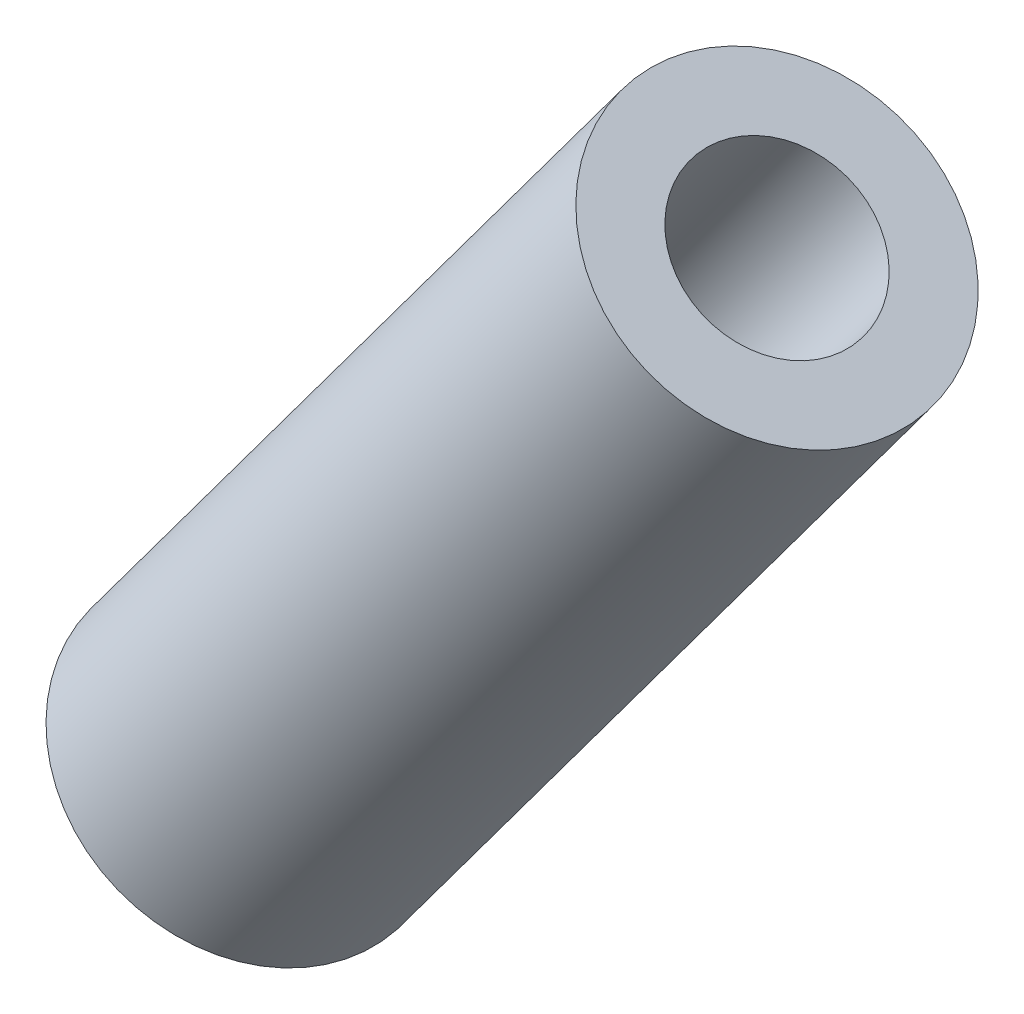
ISO-10303-21;
HEADER;
FILE_DESCRIPTION(('STEP AP214'),'2;1');
FILE_NAME('part.step','',(''),(''),'','','');
FILE_SCHEMA(('AUTOMOTIVE_DESIGN { 1 0 10303 214 1 1 1 1 }'));
ENDSEC;
DATA;
#1=APPLICATION_CONTEXT('core data for automotive mechanical design processes');
#2=APPLICATION_PROTOCOL_DEFINITION('international standard','automotive_design',2000,#1);
#3=PRODUCT_CONTEXT('',#1,'mechanical');
#4=PRODUCT('Part','Part','',(#3));
#5=PRODUCT_RELATED_PRODUCT_CATEGORY('part','',(#4));
#6=PRODUCT_DEFINITION_FORMATION('','',#4);
#7=PRODUCT_DEFINITION_CONTEXT('part definition',#1,'design');
#8=PRODUCT_DEFINITION('design','',#6,#7);
#9=PRODUCT_DEFINITION_SHAPE('','',#8);
#10=(LENGTH_UNIT() NAMED_UNIT(*) SI_UNIT(.MILLI.,.METRE.));
#11=(NAMED_UNIT(*) PLANE_ANGLE_UNIT() SI_UNIT($,.RADIAN.));
#12=(NAMED_UNIT(*) SI_UNIT($,.STERADIAN.) SOLID_ANGLE_UNIT());
#13=UNCERTAINTY_MEASURE_WITH_UNIT(LENGTH_MEASURE(1.E-05),#10,'distance_accuracy_value','');
#14=(GEOMETRIC_REPRESENTATION_CONTEXT(3) GLOBAL_UNCERTAINTY_ASSIGNED_CONTEXT((#13)) GLOBAL_UNIT_ASSIGNED_CONTEXT((#10,
#11,#12)) REPRESENTATION_CONTEXT('',''));
#15=CARTESIAN_POINT('',(0.,0.,0.));
#16=DIRECTION('',(0.,0.,1.));
#17=DIRECTION('',(1.,0.,0.));
#18=AXIS2_PLACEMENT_3D('',#15,#16,#17);
#19=CARTESIAN_POINT('',(0.,0.,0.));
#20=DIRECTION('',(0.596262476018023,0.802789548818902,0.));
#21=DIRECTION('',(-0.802789548818902,0.596262476018023,0.));
#22=AXIS2_PLACEMENT_3D('',#19,#20,#21);
#23=PLANE('',#22);
#24=CARTESIAN_POINT('',(0.,0.,0.));
#25=DIRECTION('',(0.596262476018023,0.802789548818902,0.));
#26=DIRECTION('',(-0.802789548818902,0.596262476018023,0.));
#27=AXIS2_PLACEMENT_3D('',#24,#25,#26);
#28=CIRCLE('',#27,5.);
#29=CARTESIAN_POINT('',(-4.01394774409451,2.98131238009012,0.));
#30=VERTEX_POINT('',#29);
#31=EDGE_CURVE('E65',#30,#30,#28,.F.);
#32=ORIENTED_EDGE('',*,*,#31,.F.);
#33=EDGE_LOOP('',(#32));
#34=FACE_BOUND('',#33,.T.);
#35=CARTESIAN_POINT('',(0.,0.,0.));
#36=DIRECTION('',(0.596262476018023,0.802789548818902,0.));
#37=DIRECTION('',(-0.802789548818902,0.596262476018023,0.));
#38=AXIS2_PLACEMENT_3D('',#35,#36,#37);
#39=CIRCLE('',#38,8.96875);
#40=CARTESIAN_POINT('',(-7.20001876596953,5.34772908178665,0.));
#41=VERTEX_POINT('',#40);
#42=EDGE_CURVE('E57',#41,#41,#39,.T.);
#43=ORIENTED_EDGE('',*,*,#42,.F.);
#44=EDGE_LOOP('',(#43));
#45=FACE_BOUND('',#44,.T.);
#46=ADVANCED_FACE('F51',(#34,#45),#23,.F.);
#47=CARTESIAN_POINT('',(30.2901337817156,40.7817090800002,0.));
#48=DIRECTION('',(0.596262476018023,0.802789548818902,0.));
#49=DIRECTION('',(-0.802789548818902,0.596262476018023,0.));
#50=AXIS2_PLACEMENT_3D('',#47,#48,#49);
#51=PLANE('',#50);
#52=CARTESIAN_POINT('',(30.2901337817156,40.7817090800002,0.));
#53=DIRECTION('',(0.596262476018023,0.802789548818902,0.));
#54=DIRECTION('',(-0.802789548818902,0.596262476018023,0.));
#55=AXIS2_PLACEMENT_3D('',#52,#53,#54);
#56=CIRCLE('',#55,5.);
#57=CARTESIAN_POINT('',(26.2761860376211,43.7630214600904,0.));
#58=VERTEX_POINT('',#57);
#59=EDGE_CURVE('E61',#58,#58,#56,.F.);
#60=ORIENTED_EDGE('',*,*,#59,.T.);
#61=EDGE_LOOP('',(#60));
#62=FACE_BOUND('',#61,.T.);
#63=CARTESIAN_POINT('',(30.2901337817156,40.7817090800002,0.));
#64=DIRECTION('',(0.596262476018023,0.802789548818902,0.));
#65=DIRECTION('',(-0.802789548818902,0.596262476018023,0.));
#66=AXIS2_PLACEMENT_3D('',#63,#64,#65);
#67=CIRCLE('',#66,8.96875);
#68=CARTESIAN_POINT('',(23.0901150157461,46.1294381617869,0.));
#69=VERTEX_POINT('',#68);
#70=EDGE_CURVE('E11',#69,#69,#67,.T.);
#71=ORIENTED_EDGE('',*,*,#70,.T.);
#72=EDGE_LOOP('',(#71));
#73=FACE_BOUND('',#72,.T.);
#74=ADVANCED_FACE('F76',(#62,#73),#51,.T.);
#75=CARTESIAN_POINT('',(0.,0.,0.));
#76=DIRECTION('',(0.596262476018023,0.802789548818902,0.));
#77=DIRECTION('',(-0.802789548818902,0.596262476018023,0.));
#78=AXIS2_PLACEMENT_3D('',#75,#76,#77);
#79=CYLINDRICAL_SURFACE('',#78,8.96875);
#80=ORIENTED_EDGE('',*,*,#70,.F.);
#81=EDGE_LOOP('',(#80));
#82=FACE_BOUND('',#81,.T.);
#83=ORIENTED_EDGE('',*,*,#42,.T.);
#84=EDGE_LOOP('',(#83));
#85=FACE_BOUND('',#84,.T.);
#86=ADVANCED_FACE('F81',(#82,#85),#79,.T.);
#87=CARTESIAN_POINT('',(-2.38504990407209,-3.21115819527561,0.));
#88=DIRECTION('',(0.596262476018023,0.802789548818902,0.));
#89=DIRECTION('',(-0.802789548818902,0.596262476018023,0.));
#90=AXIS2_PLACEMENT_3D('',#87,#88,#89);
#91=CYLINDRICAL_SURFACE('',#90,5.);
#92=ORIENTED_EDGE('',*,*,#31,.T.);
#93=EDGE_LOOP('',(#92));
#94=FACE_BOUND('',#93,.T.);
#95=ORIENTED_EDGE('',*,*,#59,.F.);
#96=EDGE_LOOP('',(#95));
#97=FACE_BOUND('',#96,.T.);
#98=ADVANCED_FACE('F71',(#94,#97),#91,.F.);
#99=CLOSED_SHELL('',(#46,#74,#86,#98));
#100=MANIFOLD_SOLID_BREP('B2',#99);
#101=ADVANCED_BREP_SHAPE_REPRESENTATION('',(#18,#100),#14);
#102=SHAPE_DEFINITION_REPRESENTATION(#9,#101);
ENDSEC;
END-ISO-10303-21;
